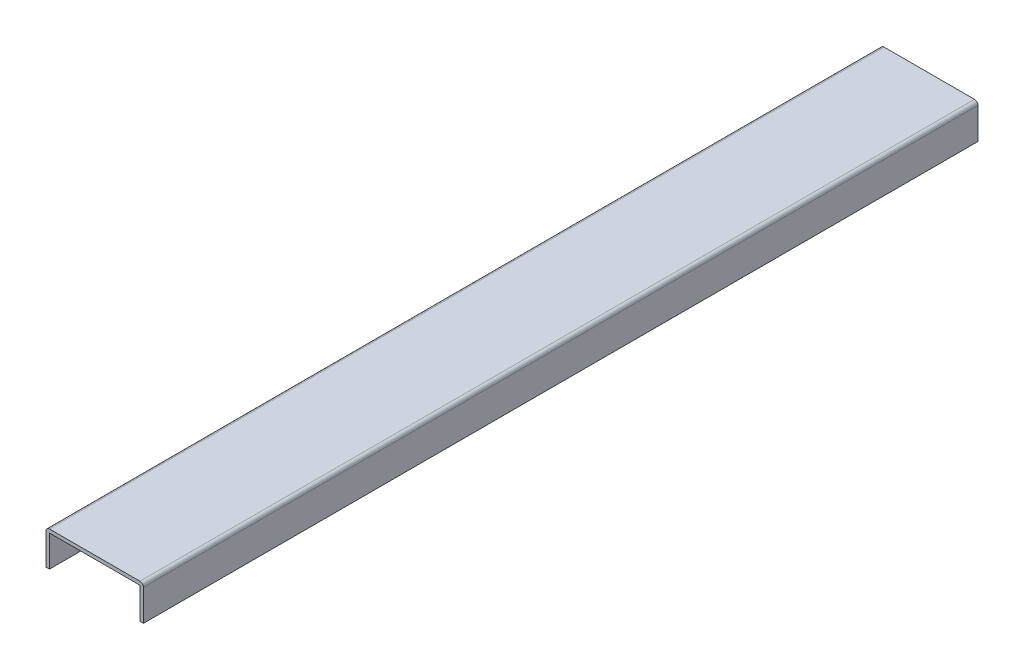
ISO-10303-21;
HEADER;
FILE_DESCRIPTION(('STEP AP214'),'2;1');
FILE_NAME('part.step','',(''),(''),'','','');
FILE_SCHEMA(('AUTOMOTIVE_DESIGN { 1 0 10303 214 1 1 1 1 }'));
ENDSEC;
DATA;
#1=APPLICATION_CONTEXT('core data for automotive mechanical design processes');
#2=APPLICATION_PROTOCOL_DEFINITION('international standard','automotive_design',2000,#1);
#3=PRODUCT_CONTEXT('',#1,'mechanical');
#4=PRODUCT('Part','Part','',(#3));
#5=PRODUCT_RELATED_PRODUCT_CATEGORY('part','',(#4));
#6=PRODUCT_DEFINITION_FORMATION('','',#4);
#7=PRODUCT_DEFINITION_CONTEXT('part definition',#1,'design');
#8=PRODUCT_DEFINITION('design','',#6,#7);
#9=PRODUCT_DEFINITION_SHAPE('','',#8);
#10=(LENGTH_UNIT() NAMED_UNIT(*) SI_UNIT(.MILLI.,.METRE.));
#11=(NAMED_UNIT(*) PLANE_ANGLE_UNIT() SI_UNIT($,.RADIAN.));
#12=(NAMED_UNIT(*) SI_UNIT($,.STERADIAN.) SOLID_ANGLE_UNIT());
#13=UNCERTAINTY_MEASURE_WITH_UNIT(LENGTH_MEASURE(1.E-05),#10,'distance_accuracy_value','');
#14=(GEOMETRIC_REPRESENTATION_CONTEXT(3) GLOBAL_UNCERTAINTY_ASSIGNED_CONTEXT((#13)) GLOBAL_UNIT_ASSIGNED_CONTEXT((#10,
#11,#12)) REPRESENTATION_CONTEXT('',''));
#15=CARTESIAN_POINT('',(0.,0.,0.));
#16=DIRECTION('',(0.,0.,1.));
#17=DIRECTION('',(1.,0.,0.));
#18=AXIS2_PLACEMENT_3D('',#15,#16,#17);
#19=CARTESIAN_POINT('',(-70.,-25.,1200.));
#20=DIRECTION('',(0.,1.,0.));
#21=DIRECTION('',(0.,0.,1.));
#22=AXIS2_PLACEMENT_3D('',#19,#20,#21);
#23=PLANE('',#22);
#24=DIRECTION('',(0.,0.,-1.));
#25=VECTOR('',#24,1.);
#26=CARTESIAN_POINT('',(-65.,-25.,1200.));
#27=LINE('',#26,#25);
#28=CARTESIAN_POINT('',(-65.,-25.,1200.));
#29=VERTEX_POINT('',#28);
#30=CARTESIAN_POINT('',(-65.,-25.,0.));
#31=VERTEX_POINT('',#30);
#32=EDGE_CURVE('E48',#29,#31,#27,.T.);
#33=ORIENTED_EDGE('',*,*,#32,.F.);
#34=DIRECTION('',(1.,0.,0.));
#35=VECTOR('',#34,1.);
#36=CARTESIAN_POINT('',(-70.,-25.,1200.));
#37=LINE('',#36,#35);
#38=CARTESIAN_POINT('',(-70.,-25.,1200.));
#39=VERTEX_POINT('',#38);
#40=EDGE_CURVE('E149',#39,#29,#37,.T.);
#41=ORIENTED_EDGE('',*,*,#40,.F.);
#42=DIRECTION('',(0.,0.,-1.));
#43=VECTOR('',#42,1.);
#44=CARTESIAN_POINT('',(-70.,-25.,1200.));
#45=LINE('',#44,#43);
#46=CARTESIAN_POINT('',(-70.,-25.,0.));
#47=VERTEX_POINT('',#46);
#48=EDGE_CURVE('E148',#39,#47,#45,.T.);
#49=ORIENTED_EDGE('',*,*,#48,.T.);
#50=DIRECTION('',(1.,0.,0.));
#51=VECTOR('',#50,1.);
#52=CARTESIAN_POINT('',(-70.,-25.,0.));
#53=LINE('',#52,#51);
#54=EDGE_CURVE('E137',#47,#31,#53,.T.);
#55=ORIENTED_EDGE('',*,*,#54,.T.);
#56=EDGE_LOOP('',(#33,#41,#49,#55));
#57=FACE_BOUND('',#56,.T.);
#58=ADVANCED_FACE('F33',(#57),#23,.F.);
#59=CARTESIAN_POINT('',(0.,0.,1200.));
#60=DIRECTION('',(0.,0.,-1.));
#61=DIRECTION('',(-1.,0.,0.));
#62=AXIS2_PLACEMENT_3D('',#59,#60,#61);
#63=PLANE('',#62);
#64=DIRECTION('',(0.,1.,0.));
#65=VECTOR('',#64,1.);
#66=CARTESIAN_POINT('',(65.,0.,1200.));
#67=LINE('',#66,#65);
#68=CARTESIAN_POINT('',(65.,-25.,1200.));
#69=VERTEX_POINT('',#68);
#70=CARTESIAN_POINT('',(65.,20.,1200.));
#71=VERTEX_POINT('',#70);
#72=EDGE_CURVE('E193',#69,#71,#67,.T.);
#73=ORIENTED_EDGE('',*,*,#72,.F.);
#74=CARTESIAN_POINT('',(70.,-25.,1200.));
#75=VERTEX_POINT('',#74);
#76=EDGE_CURVE('E130',#69,#75,#37,.T.);
#77=ORIENTED_EDGE('',*,*,#76,.T.);
#78=DIRECTION('',(0.,1.,0.));
#79=VECTOR('',#78,1.);
#80=CARTESIAN_POINT('',(70.,-25.,1200.));
#81=LINE('',#80,#79);
#82=CARTESIAN_POINT('',(70.,20.,1200.));
#83=VERTEX_POINT('',#82);
#84=EDGE_CURVE('E141',#75,#83,#81,.T.);
#85=ORIENTED_EDGE('',*,*,#84,.T.);
#86=CARTESIAN_POINT('',(65.,20.,1200.));
#87=DIRECTION('',(0.,0.,-1.));
#88=DIRECTION('',(-1.,0.,0.));
#89=AXIS2_PLACEMENT_3D('',#86,#87,#88);
#90=CIRCLE('',#89,5.);
#91=CARTESIAN_POINT('',(65.,25.,1200.));
#92=VERTEX_POINT('',#91);
#93=EDGE_CURVE('E41',#83,#92,#90,.F.);
#94=ORIENTED_EDGE('',*,*,#93,.T.);
#95=DIRECTION('',(-1.,0.,0.));
#96=VECTOR('',#95,1.);
#97=CARTESIAN_POINT('',(-70.,25.,1200.));
#98=LINE('',#97,#96);
#99=CARTESIAN_POINT('',(-65.,25.,1200.));
#100=VERTEX_POINT('',#99);
#101=EDGE_CURVE('E167',#92,#100,#98,.T.);
#102=ORIENTED_EDGE('',*,*,#101,.T.);
#103=CARTESIAN_POINT('',(-65.,20.,1200.));
#104=DIRECTION('',(0.,0.,-1.));
#105=DIRECTION('',(-1.,0.,0.));
#106=AXIS2_PLACEMENT_3D('',#103,#104,#105);
#107=CIRCLE('',#106,5.);
#108=CARTESIAN_POINT('',(-70.,20.,1200.));
#109=VERTEX_POINT('',#108);
#110=EDGE_CURVE('E56',#100,#109,#107,.F.);
#111=ORIENTED_EDGE('',*,*,#110,.T.);
#112=DIRECTION('',(0.,-1.,0.));
#113=VECTOR('',#112,1.);
#114=CARTESIAN_POINT('',(-70.,-25.,1200.));
#115=LINE('',#114,#113);
#116=EDGE_CURVE('E177',#109,#39,#115,.T.);
#117=ORIENTED_EDGE('',*,*,#116,.T.);
#118=ORIENTED_EDGE('',*,*,#40,.T.);
#119=DIRECTION('',(0.,-1.,0.));
#120=VECTOR('',#119,1.);
#121=CARTESIAN_POINT('',(-65.,0.,1200.));
#122=LINE('',#121,#120);
#123=CARTESIAN_POINT('',(-65.,20.,1200.));
#124=VERTEX_POINT('',#123);
#125=EDGE_CURVE('E131',#124,#29,#122,.T.);
#126=ORIENTED_EDGE('',*,*,#125,.F.);
#127=DIRECTION('',(-1.,0.,0.));
#128=VECTOR('',#127,1.);
#129=CARTESIAN_POINT('',(0.,20.,1200.));
#130=LINE('',#129,#128);
#131=EDGE_CURVE('E196',#71,#124,#130,.T.);
#132=ORIENTED_EDGE('',*,*,#131,.F.);
#133=EDGE_LOOP('',(#73,#77,#85,#94,#102,#111,#117,#118,#126,#132));
#134=FACE_BOUND('',#133,.T.);
#135=ADVANCED_FACE('F166',(#134),#63,.F.);
#136=CARTESIAN_POINT('',(0.,0.,0.));
#137=DIRECTION('',(0.,0.,-1.));
#138=DIRECTION('',(-1.,0.,0.));
#139=AXIS2_PLACEMENT_3D('',#136,#137,#138);
#140=PLANE('',#139);
#141=CARTESIAN_POINT('',(65.,-25.,0.));
#142=VERTEX_POINT('',#141);
#143=CARTESIAN_POINT('',(70.,-25.,0.));
#144=VERTEX_POINT('',#143);
#145=EDGE_CURVE('E128',#142,#144,#53,.T.);
#146=ORIENTED_EDGE('',*,*,#145,.F.);
#147=DIRECTION('',(0.,1.,0.));
#148=VECTOR('',#147,1.);
#149=CARTESIAN_POINT('',(65.,0.,0.));
#150=LINE('',#149,#148);
#151=CARTESIAN_POINT('',(65.,20.,0.));
#152=VERTEX_POINT('',#151);
#153=EDGE_CURVE('E111',#142,#152,#150,.T.);
#154=ORIENTED_EDGE('',*,*,#153,.T.);
#155=DIRECTION('',(-1.,0.,0.));
#156=VECTOR('',#155,1.);
#157=CARTESIAN_POINT('',(0.,20.,0.));
#158=LINE('',#157,#156);
#159=CARTESIAN_POINT('',(-65.,20.,0.));
#160=VERTEX_POINT('',#159);
#161=EDGE_CURVE('E122',#152,#160,#158,.T.);
#162=ORIENTED_EDGE('',*,*,#161,.T.);
#163=DIRECTION('',(0.,-1.,0.));
#164=VECTOR('',#163,1.);
#165=CARTESIAN_POINT('',(-65.,0.,0.));
#166=LINE('',#165,#164);
#167=EDGE_CURVE('E191',#160,#31,#166,.T.);
#168=ORIENTED_EDGE('',*,*,#167,.T.);
#169=ORIENTED_EDGE('',*,*,#54,.F.);
#170=DIRECTION('',(0.,-1.,0.));
#171=VECTOR('',#170,1.);
#172=CARTESIAN_POINT('',(-70.,-25.,0.));
#173=LINE('',#172,#171);
#174=CARTESIAN_POINT('',(-70.,20.,0.));
#175=VERTEX_POINT('',#174);
#176=EDGE_CURVE('E138',#175,#47,#173,.T.);
#177=ORIENTED_EDGE('',*,*,#176,.F.);
#178=CARTESIAN_POINT('',(-65.,20.,0.));
#179=DIRECTION('',(0.,0.,-1.));
#180=DIRECTION('',(-1.,0.,0.));
#181=AXIS2_PLACEMENT_3D('',#178,#179,#180);
#182=CIRCLE('',#181,5.);
#183=CARTESIAN_POINT('',(-65.,25.,0.));
#184=VERTEX_POINT('',#183);
#185=EDGE_CURVE('E157',#175,#184,#182,.T.);
#186=ORIENTED_EDGE('',*,*,#185,.T.);
#187=DIRECTION('',(-1.,0.,0.));
#188=VECTOR('',#187,1.);
#189=CARTESIAN_POINT('',(-70.,25.,0.));
#190=LINE('',#189,#188);
#191=CARTESIAN_POINT('',(65.,25.,0.));
#192=VERTEX_POINT('',#191);
#193=EDGE_CURVE('E142',#192,#184,#190,.T.);
#194=ORIENTED_EDGE('',*,*,#193,.F.);
#195=CARTESIAN_POINT('',(65.,20.,0.));
#196=DIRECTION('',(0.,0.,-1.));
#197=DIRECTION('',(-1.,0.,0.));
#198=AXIS2_PLACEMENT_3D('',#195,#196,#197);
#199=CIRCLE('',#198,5.);
#200=CARTESIAN_POINT('',(70.,20.,0.));
#201=VERTEX_POINT('',#200);
#202=EDGE_CURVE('E159',#192,#201,#199,.T.);
#203=ORIENTED_EDGE('',*,*,#202,.T.);
#204=DIRECTION('',(0.,1.,0.));
#205=VECTOR('',#204,1.);
#206=CARTESIAN_POINT('',(70.,-25.,0.));
#207=LINE('',#206,#205);
#208=EDGE_CURVE('E136',#144,#201,#207,.T.);
#209=ORIENTED_EDGE('',*,*,#208,.F.);
#210=EDGE_LOOP('',(#146,#154,#162,#168,#169,#177,#186,#194,#203,#209));
#211=FACE_BOUND('',#210,.T.);
#212=ADVANCED_FACE('F134',(#211),#140,.T.);
#213=CARTESIAN_POINT('',(70.,-25.,1200.));
#214=DIRECTION('',(-1.,0.,0.));
#215=DIRECTION('',(0.,0.,1.));
#216=AXIS2_PLACEMENT_3D('',#213,#214,#215);
#217=PLANE('',#216);
#218=ORIENTED_EDGE('',*,*,#208,.T.);
#219=DIRECTION('',(0.,0.,-1.));
#220=VECTOR('',#219,1.);
#221=CARTESIAN_POINT('',(70.,20.,1200.));
#222=LINE('',#221,#220);
#223=EDGE_CURVE('E161',#201,#83,#222,.F.);
#224=ORIENTED_EDGE('',*,*,#223,.T.);
#225=ORIENTED_EDGE('',*,*,#84,.F.);
#226=DIRECTION('',(0.,0.,-1.));
#227=VECTOR('',#226,1.);
#228=CARTESIAN_POINT('',(70.,-25.,1200.));
#229=LINE('',#228,#227);
#230=EDGE_CURVE('E146',#75,#144,#229,.T.);
#231=ORIENTED_EDGE('',*,*,#230,.T.);
#232=EDGE_LOOP('',(#218,#224,#225,#231));
#233=FACE_BOUND('',#232,.T.);
#234=ADVANCED_FACE('F181',(#233),#217,.F.);
#235=CARTESIAN_POINT('',(-70.,25.,1200.));
#236=DIRECTION('',(0.,-1.,0.));
#237=DIRECTION('',(0.,0.,-1.));
#238=AXIS2_PLACEMENT_3D('',#235,#236,#237);
#239=PLANE('',#238);
#240=ORIENTED_EDGE('',*,*,#101,.F.);
#241=DIRECTION('',(0.,0.,-1.));
#242=VECTOR('',#241,1.);
#243=CARTESIAN_POINT('',(65.,25.,1200.));
#244=LINE('',#243,#242);
#245=EDGE_CURVE('E154',#92,#192,#244,.T.);
#246=ORIENTED_EDGE('',*,*,#245,.T.);
#247=ORIENTED_EDGE('',*,*,#193,.T.);
#248=DIRECTION('',(0.,0.,-1.));
#249=VECTOR('',#248,1.);
#250=CARTESIAN_POINT('',(-65.,25.,1200.));
#251=LINE('',#250,#249);
#252=EDGE_CURVE('E152',#184,#100,#251,.F.);
#253=ORIENTED_EDGE('',*,*,#252,.T.);
#254=EDGE_LOOP('',(#240,#246,#247,#253));
#255=FACE_BOUND('',#254,.T.);
#256=ADVANCED_FACE('F173',(#255),#239,.F.);
#257=CARTESIAN_POINT('',(-70.,-25.,1200.));
#258=DIRECTION('',(1.,0.,0.));
#259=DIRECTION('',(0.,0.,-1.));
#260=AXIS2_PLACEMENT_3D('',#257,#258,#259);
#261=PLANE('',#260);
#262=ORIENTED_EDGE('',*,*,#116,.F.);
#263=DIRECTION('',(0.,0.,-1.));
#264=VECTOR('',#263,1.);
#265=CARTESIAN_POINT('',(-70.,20.,1200.));
#266=LINE('',#265,#264);
#267=EDGE_CURVE('E11',#109,#175,#266,.T.);
#268=ORIENTED_EDGE('',*,*,#267,.T.);
#269=ORIENTED_EDGE('',*,*,#176,.T.);
#270=ORIENTED_EDGE('',*,*,#48,.F.);
#271=EDGE_LOOP('',(#262,#268,#269,#270));
#272=FACE_BOUND('',#271,.T.);
#273=ADVANCED_FACE('F211',(#272),#261,.F.);
#274=ORIENTED_EDGE('',*,*,#76,.F.);
#275=DIRECTION('',(0.,0.,-1.));
#276=VECTOR('',#275,1.);
#277=CARTESIAN_POINT('',(65.,-25.,1200.));
#278=LINE('',#277,#276);
#279=EDGE_CURVE('E115',#69,#142,#278,.T.);
#280=ORIENTED_EDGE('',*,*,#279,.T.);
#281=ORIENTED_EDGE('',*,*,#145,.T.);
#282=ORIENTED_EDGE('',*,*,#230,.F.);
#283=EDGE_LOOP('',(#274,#280,#281,#282));
#284=FACE_BOUND('',#283,.T.);
#285=ADVANCED_FACE('F126',(#284),#23,.F.);
#286=CARTESIAN_POINT('',(65.,20.,1200.));
#287=DIRECTION('',(0.,0.,-1.));
#288=DIRECTION('',(-1.,0.,0.));
#289=AXIS2_PLACEMENT_3D('',#286,#287,#288);
#290=CYLINDRICAL_SURFACE('',#289,5.);
#291=ORIENTED_EDGE('',*,*,#93,.F.);
#292=ORIENTED_EDGE('',*,*,#223,.F.);
#293=ORIENTED_EDGE('',*,*,#202,.F.);
#294=ORIENTED_EDGE('',*,*,#245,.F.);
#295=EDGE_LOOP('',(#291,#292,#293,#294));
#296=FACE_BOUND('',#295,.T.);
#297=ADVANCED_FACE('F179',(#296),#290,.T.);
#298=CARTESIAN_POINT('',(-65.,20.,1200.));
#299=DIRECTION('',(0.,0.,-1.));
#300=DIRECTION('',(-1.,0.,0.));
#301=AXIS2_PLACEMENT_3D('',#298,#299,#300);
#302=CYLINDRICAL_SURFACE('',#301,5.);
#303=ORIENTED_EDGE('',*,*,#110,.F.);
#304=ORIENTED_EDGE('',*,*,#252,.F.);
#305=ORIENTED_EDGE('',*,*,#185,.F.);
#306=ORIENTED_EDGE('',*,*,#267,.F.);
#307=EDGE_LOOP('',(#303,#304,#305,#306));
#308=FACE_BOUND('',#307,.T.);
#309=ADVANCED_FACE('F35',(#308),#302,.T.);
#310=CARTESIAN_POINT('',(65.,-25.,1200.));
#311=DIRECTION('',(-1.,0.,0.));
#312=DIRECTION('',(0.,0.,1.));
#313=AXIS2_PLACEMENT_3D('',#310,#311,#312);
#314=PLANE('',#313);
#315=ORIENTED_EDGE('',*,*,#153,.F.);
#316=ORIENTED_EDGE('',*,*,#279,.F.);
#317=ORIENTED_EDGE('',*,*,#72,.T.);
#318=DIRECTION('',(0.,0.,1.));
#319=VECTOR('',#318,1.);
#320=CARTESIAN_POINT('',(65.,20.,1200.));
#321=LINE('',#320,#319);
#322=EDGE_CURVE('E117',#152,#71,#321,.T.);
#323=ORIENTED_EDGE('',*,*,#322,.F.);
#324=EDGE_LOOP('',(#315,#316,#317,#323));
#325=FACE_BOUND('',#324,.T.);
#326=ADVANCED_FACE('F113',(#325),#314,.T.);
#327=CARTESIAN_POINT('',(-70.,20.,1200.));
#328=DIRECTION('',(0.,-1.,0.));
#329=DIRECTION('',(0.,0.,-1.));
#330=AXIS2_PLACEMENT_3D('',#327,#328,#329);
#331=PLANE('',#330);
#332=ORIENTED_EDGE('',*,*,#131,.T.);
#333=DIRECTION('',(0.,0.,1.));
#334=VECTOR('',#333,1.);
#335=CARTESIAN_POINT('',(-65.,20.,1200.));
#336=LINE('',#335,#334);
#337=EDGE_CURVE('E183',#160,#124,#336,.T.);
#338=ORIENTED_EDGE('',*,*,#337,.F.);
#339=ORIENTED_EDGE('',*,*,#161,.F.);
#340=ORIENTED_EDGE('',*,*,#322,.T.);
#341=EDGE_LOOP('',(#332,#338,#339,#340));
#342=FACE_BOUND('',#341,.T.);
#343=ADVANCED_FACE('F204',(#342),#331,.T.);
#344=CARTESIAN_POINT('',(-65.,-25.,1200.));
#345=DIRECTION('',(1.,0.,0.));
#346=DIRECTION('',(0.,0.,-1.));
#347=AXIS2_PLACEMENT_3D('',#344,#345,#346);
#348=PLANE('',#347);
#349=ORIENTED_EDGE('',*,*,#125,.T.);
#350=ORIENTED_EDGE('',*,*,#32,.T.);
#351=ORIENTED_EDGE('',*,*,#167,.F.);
#352=ORIENTED_EDGE('',*,*,#337,.T.);
#353=EDGE_LOOP('',(#349,#350,#351,#352));
#354=FACE_BOUND('',#353,.T.);
#355=ADVANCED_FACE('F200',(#354),#348,.T.);
#356=CLOSED_SHELL('',(#58,#135,#212,#234,#256,#273,#285,#297,#309,#326,#343,#355));
#357=MANIFOLD_SOLID_BREP('B2',#356);
#358=ADVANCED_BREP_SHAPE_REPRESENTATION('',(#18,#357),#14);
#359=SHAPE_DEFINITION_REPRESENTATION(#9,#358);
ENDSEC;
END-ISO-10303-21;
